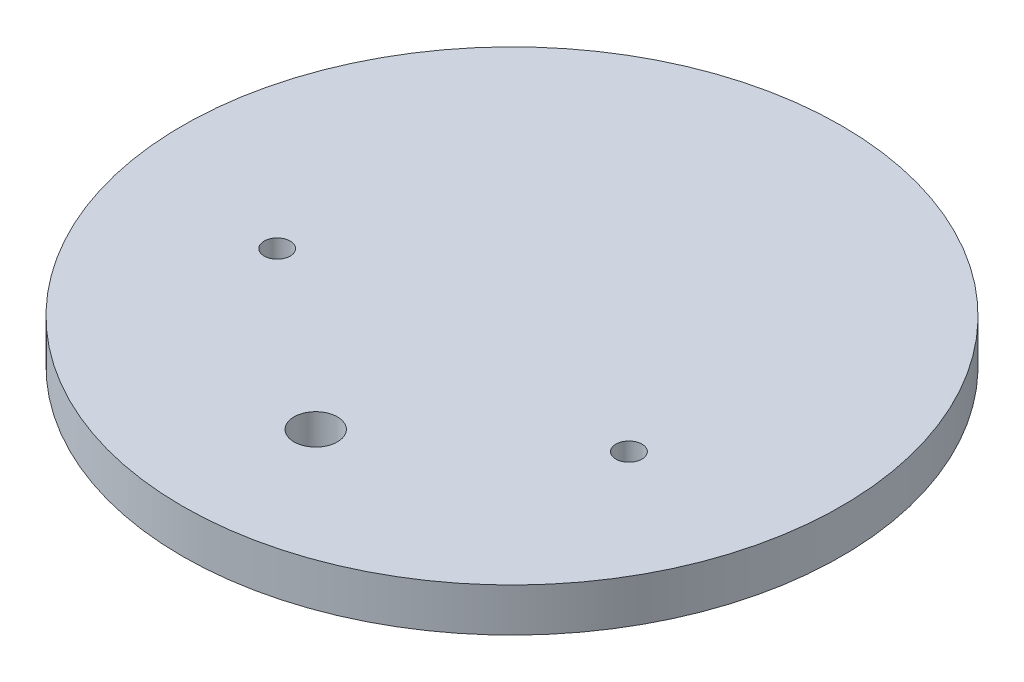
ISO-10303-21;
HEADER;
FILE_DESCRIPTION(('STEP AP214'),'2;1');
FILE_NAME('part.step','',(''),(''),'','','');
FILE_SCHEMA(('AUTOMOTIVE_DESIGN { 1 0 10303 214 1 1 1 1 }'));
ENDSEC;
DATA;
#1=APPLICATION_CONTEXT('core data for automotive mechanical design processes');
#2=APPLICATION_PROTOCOL_DEFINITION('international standard','automotive_design',2000,#1);
#3=PRODUCT_CONTEXT('',#1,'mechanical');
#4=PRODUCT('Part','Part','',(#3));
#5=PRODUCT_RELATED_PRODUCT_CATEGORY('part','',(#4));
#6=PRODUCT_DEFINITION_FORMATION('','',#4);
#7=PRODUCT_DEFINITION_CONTEXT('part definition',#1,'design');
#8=PRODUCT_DEFINITION('design','',#6,#7);
#9=PRODUCT_DEFINITION_SHAPE('','',#8);
#10=(LENGTH_UNIT() NAMED_UNIT(*) SI_UNIT(.MILLI.,.METRE.));
#11=(NAMED_UNIT(*) PLANE_ANGLE_UNIT() SI_UNIT($,.RADIAN.));
#12=(NAMED_UNIT(*) SI_UNIT($,.STERADIAN.) SOLID_ANGLE_UNIT());
#13=UNCERTAINTY_MEASURE_WITH_UNIT(LENGTH_MEASURE(1.E-05),#10,'distance_accuracy_value','');
#14=(GEOMETRIC_REPRESENTATION_CONTEXT(3) GLOBAL_UNCERTAINTY_ASSIGNED_CONTEXT((#13)) GLOBAL_UNIT_ASSIGNED_CONTEXT((#10,
#11,#12)) REPRESENTATION_CONTEXT('',''));
#15=CARTESIAN_POINT('',(0.,0.,0.));
#16=DIRECTION('',(0.,0.,1.));
#17=DIRECTION('',(1.,0.,0.));
#18=AXIS2_PLACEMENT_3D('',#15,#16,#17);
#19=CARTESIAN_POINT('',(0.,5.,0.));
#20=DIRECTION('',(0.,1.,0.));
#21=DIRECTION('',(0.,0.,0.999999999999998));
#22=AXIS2_PLACEMENT_3D('',#19,#20,#21);
#23=PLANE('',#22);
#24=CARTESIAN_POINT('',(20.2618935761119,5.,6.79865696155026));
#25=DIRECTION('',(0.,1.,0.));
#26=DIRECTION('',(0.,0.,0.999999999999998));
#27=AXIS2_PLACEMENT_3D('',#24,#25,#26);
#28=CIRCLE('',#27,1.5);
#29=CARTESIAN_POINT('',(20.2618935761119,5.,8.29865696155026));
#30=VERTEX_POINT('',#29);
#31=EDGE_CURVE('E72',#30,#30,#28,.T.);
#32=ORIENTED_EDGE('',*,*,#31,.F.);
#33=EDGE_LOOP('',(#32));
#34=FACE_BOUND('',#33,.T.);
#35=CARTESIAN_POINT('',(0.,5.,0.));
#36=DIRECTION('',(0.,1.,0.));
#37=DIRECTION('',(0.,0.,0.999999999999998));
#38=AXIS2_PLACEMENT_3D('',#35,#36,#37);
#39=CIRCLE('',#38,37.95);
#40=CARTESIAN_POINT('',(0.,5.,37.9499999999999));
#41=VERTEX_POINT('',#40);
#42=EDGE_CURVE('E12',#41,#41,#39,.T.);
#43=ORIENTED_EDGE('',*,*,#42,.T.);
#44=EDGE_LOOP('',(#43));
#45=FACE_BOUND('',#44,.T.);
#46=CARTESIAN_POINT('',(-20.238106423888,5.,6.79865696155026));
#47=DIRECTION('',(0.,1.,0.));
#48=DIRECTION('',(0.,0.,0.999999999999998));
#49=AXIS2_PLACEMENT_3D('',#46,#47,#48);
#50=CIRCLE('',#49,1.5);
#51=CARTESIAN_POINT('',(-20.238106423888,5.,8.29865696155026));
#52=VERTEX_POINT('',#51);
#53=EDGE_CURVE('E66',#52,#52,#50,.T.);
#54=ORIENTED_EDGE('',*,*,#53,.F.);
#55=EDGE_LOOP('',(#54));
#56=FACE_BOUND('',#55,.T.);
#57=CARTESIAN_POINT('',(0.0118935761119768,5.,22.6162207319467));
#58=DIRECTION('',(0.,1.,0.));
#59=DIRECTION('',(0.,0.,0.999999999999998));
#60=AXIS2_PLACEMENT_3D('',#57,#58,#59);
#61=CIRCLE('',#60,2.5);
#62=CARTESIAN_POINT('',(0.0118935761119769,5.,25.1162207319467));
#63=VERTEX_POINT('',#62);
#64=EDGE_CURVE('E80',#63,#63,#61,.T.);
#65=ORIENTED_EDGE('',*,*,#64,.F.);
#66=EDGE_LOOP('',(#65));
#67=FACE_BOUND('',#66,.T.);
#68=ADVANCED_FACE('F51',(#34,#45,#56,#67),#23,.T.);
#69=CARTESIAN_POINT('',(0.,0.,0.));
#70=DIRECTION('',(0.,1.,0.));
#71=DIRECTION('',(0.,0.,0.999999999999998));
#72=AXIS2_PLACEMENT_3D('',#69,#70,#71);
#73=PLANE('',#72);
#74=CARTESIAN_POINT('',(0.,0.,0.));
#75=DIRECTION('',(0.,1.,0.));
#76=DIRECTION('',(0.,0.,0.999999999999998));
#77=AXIS2_PLACEMENT_3D('',#74,#75,#76);
#78=CIRCLE('',#77,37.95);
#79=CARTESIAN_POINT('',(0.,0.,37.9499999999999));
#80=VERTEX_POINT('',#79);
#81=EDGE_CURVE('E55',#80,#80,#78,.T.);
#82=ORIENTED_EDGE('',*,*,#81,.F.);
#83=EDGE_LOOP('',(#82));
#84=FACE_BOUND('',#83,.T.);
#85=CARTESIAN_POINT('',(-20.238106423888,0.,6.79865696155026));
#86=DIRECTION('',(0.,1.,0.));
#87=DIRECTION('',(0.,0.,0.999999999999998));
#88=AXIS2_PLACEMENT_3D('',#85,#86,#87);
#89=CIRCLE('',#88,1.5);
#90=CARTESIAN_POINT('',(-20.238106423888,0.,8.29865696155026));
#91=VERTEX_POINT('',#90);
#92=EDGE_CURVE('E68',#91,#91,#89,.T.);
#93=ORIENTED_EDGE('',*,*,#92,.T.);
#94=EDGE_LOOP('',(#93));
#95=FACE_BOUND('',#94,.T.);
#96=CARTESIAN_POINT('',(20.2618935761119,0.,6.79865696155026));
#97=DIRECTION('',(0.,1.,0.));
#98=DIRECTION('',(0.,0.,0.999999999999998));
#99=AXIS2_PLACEMENT_3D('',#96,#97,#98);
#100=CIRCLE('',#99,1.5);
#101=CARTESIAN_POINT('',(20.2618935761119,0.,8.29865696155026));
#102=VERTEX_POINT('',#101);
#103=EDGE_CURVE('E76',#102,#102,#100,.T.);
#104=ORIENTED_EDGE('',*,*,#103,.T.);
#105=EDGE_LOOP('',(#104));
#106=FACE_BOUND('',#105,.T.);
#107=CARTESIAN_POINT('',(0.0118935761119768,0.,22.6162207319467));
#108=DIRECTION('',(0.,1.,0.));
#109=DIRECTION('',(0.,0.,0.999999999999998));
#110=AXIS2_PLACEMENT_3D('',#107,#108,#109);
#111=CIRCLE('',#110,2.5);
#112=CARTESIAN_POINT('',(0.0118935761119769,0.,25.1162207319467));
#113=VERTEX_POINT('',#112);
#114=EDGE_CURVE('E84',#113,#113,#111,.T.);
#115=ORIENTED_EDGE('',*,*,#114,.T.);
#116=EDGE_LOOP('',(#115));
#117=FACE_BOUND('',#116,.T.);
#118=ADVANCED_FACE('F98',(#84,#95,#106,#117),#73,.F.);
#119=CARTESIAN_POINT('',(0.,5.,0.));
#120=DIRECTION('',(0.,-1.,0.));
#121=DIRECTION('',(0.,0.,-0.999999999999998));
#122=AXIS2_PLACEMENT_3D('',#119,#120,#121);
#123=CYLINDRICAL_SURFACE('',#122,37.95);
#124=ORIENTED_EDGE('',*,*,#42,.F.);
#125=EDGE_LOOP('',(#124));
#126=FACE_BOUND('',#125,.T.);
#127=ORIENTED_EDGE('',*,*,#81,.T.);
#128=EDGE_LOOP('',(#127));
#129=FACE_BOUND('',#128,.T.);
#130=ADVANCED_FACE('F53',(#126,#129),#123,.T.);
#131=CARTESIAN_POINT('',(-20.238106423888,5.,6.79865696155026));
#132=DIRECTION('',(0.,-1.,0.));
#133=DIRECTION('',(0.,0.,-0.999999999999998));
#134=AXIS2_PLACEMENT_3D('',#131,#132,#133);
#135=CYLINDRICAL_SURFACE('',#134,1.5);
#136=ORIENTED_EDGE('',*,*,#53,.T.);
#137=EDGE_LOOP('',(#136));
#138=FACE_BOUND('',#137,.T.);
#139=ORIENTED_EDGE('',*,*,#92,.F.);
#140=EDGE_LOOP('',(#139));
#141=FACE_BOUND('',#140,.T.);
#142=ADVANCED_FACE('F107',(#138,#141),#135,.F.);
#143=CARTESIAN_POINT('',(20.2618935761119,5.,6.79865696155026));
#144=DIRECTION('',(0.,-1.,0.));
#145=DIRECTION('',(0.,0.,-0.999999999999998));
#146=AXIS2_PLACEMENT_3D('',#143,#144,#145);
#147=CYLINDRICAL_SURFACE('',#146,1.5);
#148=ORIENTED_EDGE('',*,*,#31,.T.);
#149=EDGE_LOOP('',(#148));
#150=FACE_BOUND('',#149,.T.);
#151=ORIENTED_EDGE('',*,*,#103,.F.);
#152=EDGE_LOOP('',(#151));
#153=FACE_BOUND('',#152,.T.);
#154=ADVANCED_FACE('F110',(#150,#153),#147,.F.);
#155=CARTESIAN_POINT('',(0.0118935761119768,5.,22.6162207319467));
#156=DIRECTION('',(0.,-1.,0.));
#157=DIRECTION('',(0.,0.,-0.999999999999998));
#158=AXIS2_PLACEMENT_3D('',#155,#156,#157);
#159=CYLINDRICAL_SURFACE('',#158,2.5);
#160=ORIENTED_EDGE('',*,*,#64,.T.);
#161=EDGE_LOOP('',(#160));
#162=FACE_BOUND('',#161,.T.);
#163=ORIENTED_EDGE('',*,*,#114,.F.);
#164=EDGE_LOOP('',(#163));
#165=FACE_BOUND('',#164,.T.);
#166=ADVANCED_FACE('F94',(#162,#165),#159,.F.);
#167=CLOSED_SHELL('',(#68,#118,#130,#142,#154,#166));
#168=MANIFOLD_SOLID_BREP('B2',#167);
#169=ADVANCED_BREP_SHAPE_REPRESENTATION('',(#18,#168),#14);
#170=SHAPE_DEFINITION_REPRESENTATION(#9,#169);
ENDSEC;
END-ISO-10303-21;
